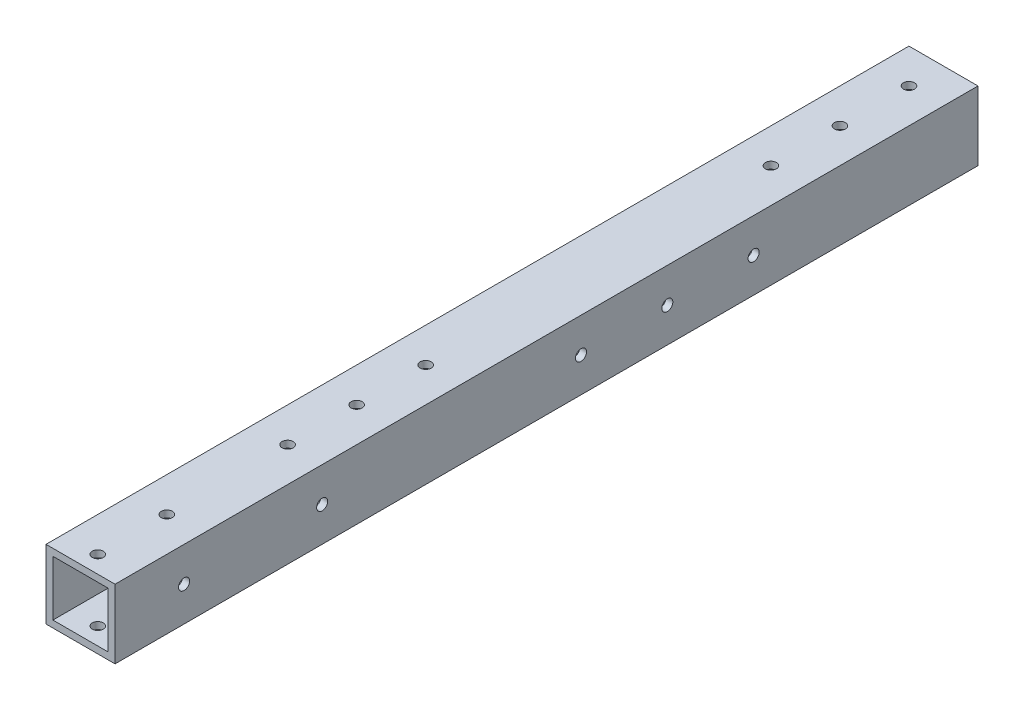
ISO-10303-21;
HEADER;
FILE_DESCRIPTION(('STEP AP214'),'2;1');
FILE_NAME('part.step','',(''),(''),'','','');
FILE_SCHEMA(('AUTOMOTIVE_DESIGN { 1 0 10303 214 1 1 1 1 }'));
ENDSEC;
DATA;
#1=APPLICATION_CONTEXT('core data for automotive mechanical design processes');
#2=APPLICATION_PROTOCOL_DEFINITION('international standard','automotive_design',2000,#1);
#3=PRODUCT_CONTEXT('',#1,'mechanical');
#4=PRODUCT('Part','Part','',(#3));
#5=PRODUCT_RELATED_PRODUCT_CATEGORY('part','',(#4));
#6=PRODUCT_DEFINITION_FORMATION('','',#4);
#7=PRODUCT_DEFINITION_CONTEXT('part definition',#1,'design');
#8=PRODUCT_DEFINITION('design','',#6,#7);
#9=PRODUCT_DEFINITION_SHAPE('','',#8);
#10=(LENGTH_UNIT() NAMED_UNIT(*) SI_UNIT(.MILLI.,.METRE.));
#11=(NAMED_UNIT(*) PLANE_ANGLE_UNIT() SI_UNIT($,.RADIAN.));
#12=(NAMED_UNIT(*) SI_UNIT($,.STERADIAN.) SOLID_ANGLE_UNIT());
#13=UNCERTAINTY_MEASURE_WITH_UNIT(LENGTH_MEASURE(1.E-05),#10,'distance_accuracy_value','');
#14=(GEOMETRIC_REPRESENTATION_CONTEXT(3) GLOBAL_UNCERTAINTY_ASSIGNED_CONTEXT((#13)) GLOBAL_UNIT_ASSIGNED_CONTEXT((#10,
#11,#12)) REPRESENTATION_CONTEXT('',''));
#15=CARTESIAN_POINT('',(0.,0.,0.));
#16=DIRECTION('',(0.,0.,1.));
#17=DIRECTION('',(1.,0.,0.));
#18=AXIS2_PLACEMENT_3D('',#15,#16,#17);
#19=CARTESIAN_POINT('',(0.,0.,250.));
#20=DIRECTION('',(0.,0.,1.));
#21=DIRECTION('',(1.,0.,0.));
#22=AXIS2_PLACEMENT_3D('',#19,#20,#21);
#23=PLANE('',#22);
#24=DIRECTION('',(0.,-1.,0.));
#25=VECTOR('',#24,1.);
#26=CARTESIAN_POINT('',(0.,0.,250.));
#27=LINE('',#26,#25);
#28=CARTESIAN_POINT('',(0.,20.,250.));
#29=VERTEX_POINT('',#28);
#30=CARTESIAN_POINT('',(0.,0.,250.));
#31=VERTEX_POINT('',#30);
#32=EDGE_CURVE('E176',#29,#31,#27,.T.);
#33=ORIENTED_EDGE('',*,*,#32,.T.);
#34=DIRECTION('',(1.,0.,0.));
#35=VECTOR('',#34,1.);
#36=CARTESIAN_POINT('',(0.,0.,250.));
#37=LINE('',#36,#35);
#38=CARTESIAN_POINT('',(20.,0.,250.));
#39=VERTEX_POINT('',#38);
#40=EDGE_CURVE('E179',#31,#39,#37,.T.);
#41=ORIENTED_EDGE('',*,*,#40,.T.);
#42=DIRECTION('',(0.,1.,0.));
#43=VECTOR('',#42,1.);
#44=CARTESIAN_POINT('',(20.,0.,250.));
#45=LINE('',#44,#43);
#46=CARTESIAN_POINT('',(20.,20.,250.));
#47=VERTEX_POINT('',#46);
#48=EDGE_CURVE('E182',#39,#47,#45,.T.);
#49=ORIENTED_EDGE('',*,*,#48,.T.);
#50=DIRECTION('',(-1.,0.,0.));
#51=VECTOR('',#50,1.);
#52=CARTESIAN_POINT('',(0.,20.,250.));
#53=LINE('',#52,#51);
#54=EDGE_CURVE('E184',#47,#29,#53,.T.);
#55=ORIENTED_EDGE('',*,*,#54,.T.);
#56=EDGE_LOOP('',(#33,#41,#49,#55));
#57=FACE_BOUND('',#56,.T.);
#58=DIRECTION('',(1.,0.,0.));
#59=VECTOR('',#58,1.);
#60=CARTESIAN_POINT('',(0.,2.,250.));
#61=LINE('',#60,#59);
#62=CARTESIAN_POINT('',(2.,2.,250.));
#63=VERTEX_POINT('',#62);
#64=CARTESIAN_POINT('',(18.,2.,250.));
#65=VERTEX_POINT('',#64);
#66=EDGE_CURVE('E146',#63,#65,#61,.T.);
#67=ORIENTED_EDGE('',*,*,#66,.F.);
#68=DIRECTION('',(0.,-1.,0.));
#69=VECTOR('',#68,1.);
#70=CARTESIAN_POINT('',(2.,0.,250.));
#71=LINE('',#70,#69);
#72=CARTESIAN_POINT('',(2.,18.,250.));
#73=VERTEX_POINT('',#72);
#74=EDGE_CURVE('E138',#73,#63,#71,.T.);
#75=ORIENTED_EDGE('',*,*,#74,.F.);
#76=DIRECTION('',(-1.,0.,0.));
#77=VECTOR('',#76,1.);
#78=CARTESIAN_POINT('',(0.,18.,250.));
#79=LINE('',#78,#77);
#80=CARTESIAN_POINT('',(18.,18.,250.));
#81=VERTEX_POINT('',#80);
#82=EDGE_CURVE('E160',#81,#73,#79,.T.);
#83=ORIENTED_EDGE('',*,*,#82,.F.);
#84=DIRECTION('',(0.,1.,0.));
#85=VECTOR('',#84,1.);
#86=CARTESIAN_POINT('',(18.,0.,250.));
#87=LINE('',#86,#85);
#88=EDGE_CURVE('E158',#65,#81,#87,.T.);
#89=ORIENTED_EDGE('',*,*,#88,.F.);
#90=EDGE_LOOP('',(#67,#75,#83,#89));
#91=FACE_BOUND('',#90,.T.);
#92=ADVANCED_FACE('F71',(#57,#91),#23,.T.);
#93=CARTESIAN_POINT('',(0.,0.,0.));
#94=DIRECTION('',(0.,0.,1.));
#95=DIRECTION('',(1.,0.,0.));
#96=AXIS2_PLACEMENT_3D('',#93,#94,#95);
#97=PLANE('',#96);
#98=DIRECTION('',(0.,-1.,0.));
#99=VECTOR('',#98,1.);
#100=CARTESIAN_POINT('',(0.,0.,0.));
#101=LINE('',#100,#99);
#102=CARTESIAN_POINT('',(0.,20.,0.));
#103=VERTEX_POINT('',#102);
#104=CARTESIAN_POINT('',(0.,0.,0.));
#105=VERTEX_POINT('',#104);
#106=EDGE_CURVE('E154',#103,#105,#101,.T.);
#107=ORIENTED_EDGE('',*,*,#106,.F.);
#108=DIRECTION('',(-1.,0.,0.));
#109=VECTOR('',#108,1.);
#110=CARTESIAN_POINT('',(0.,20.,0.));
#111=LINE('',#110,#109);
#112=CARTESIAN_POINT('',(20.,20.,0.));
#113=VERTEX_POINT('',#112);
#114=EDGE_CURVE('E180',#113,#103,#111,.T.);
#115=ORIENTED_EDGE('',*,*,#114,.F.);
#116=DIRECTION('',(0.,1.,0.));
#117=VECTOR('',#116,1.);
#118=CARTESIAN_POINT('',(20.,0.,0.));
#119=LINE('',#118,#117);
#120=CARTESIAN_POINT('',(20.,0.,0.));
#121=VERTEX_POINT('',#120);
#122=EDGE_CURVE('E191',#121,#113,#119,.T.);
#123=ORIENTED_EDGE('',*,*,#122,.F.);
#124=DIRECTION('',(1.,0.,0.));
#125=VECTOR('',#124,1.);
#126=CARTESIAN_POINT('',(0.,0.,0.));
#127=LINE('',#126,#125);
#128=EDGE_CURVE('E189',#105,#121,#127,.T.);
#129=ORIENTED_EDGE('',*,*,#128,.F.);
#130=EDGE_LOOP('',(#107,#115,#123,#129));
#131=FACE_BOUND('',#130,.T.);
#132=DIRECTION('',(0.,-1.,0.));
#133=VECTOR('',#132,1.);
#134=CARTESIAN_POINT('',(2.,0.,0.));
#135=LINE('',#134,#133);
#136=CARTESIAN_POINT('',(2.,18.,0.));
#137=VERTEX_POINT('',#136);
#138=CARTESIAN_POINT('',(2.,2.,0.));
#139=VERTEX_POINT('',#138);
#140=EDGE_CURVE('E96',#137,#139,#135,.T.);
#141=ORIENTED_EDGE('',*,*,#140,.T.);
#142=DIRECTION('',(1.,0.,0.));
#143=VECTOR('',#142,1.);
#144=CARTESIAN_POINT('',(0.,2.,0.));
#145=LINE('',#144,#143);
#146=CARTESIAN_POINT('',(18.,2.,0.));
#147=VERTEX_POINT('',#146);
#148=EDGE_CURVE('E153',#139,#147,#145,.T.);
#149=ORIENTED_EDGE('',*,*,#148,.T.);
#150=DIRECTION('',(0.,1.,0.));
#151=VECTOR('',#150,1.);
#152=CARTESIAN_POINT('',(18.,0.,0.));
#153=LINE('',#152,#151);
#154=CARTESIAN_POINT('',(18.,18.,0.));
#155=VERTEX_POINT('',#154);
#156=EDGE_CURVE('E168',#147,#155,#153,.T.);
#157=ORIENTED_EDGE('',*,*,#156,.T.);
#158=DIRECTION('',(-1.,0.,0.));
#159=VECTOR('',#158,1.);
#160=CARTESIAN_POINT('',(0.,18.,0.));
#161=LINE('',#160,#159);
#162=EDGE_CURVE('E147',#155,#137,#161,.T.);
#163=ORIENTED_EDGE('',*,*,#162,.T.);
#164=EDGE_LOOP('',(#141,#149,#157,#163));
#165=FACE_BOUND('',#164,.T.);
#166=ADVANCED_FACE('F377',(#131,#165),#97,.F.);
#167=CARTESIAN_POINT('',(0.,0.,250.));
#168=DIRECTION('',(1.,0.,0.));
#169=DIRECTION('',(0.,0.,-1.));
#170=AXIS2_PLACEMENT_3D('',#167,#168,#169);
#171=PLANE('',#170);
#172=CARTESIAN_POINT('',(0.,9.99999999999999,65.));
#173=DIRECTION('',(1.,0.,0.));
#174=DIRECTION('',(0.,0.,-1.));
#175=AXIS2_PLACEMENT_3D('',#172,#173,#174);
#176=CIRCLE('',#175,1.6);
#177=CARTESIAN_POINT('',(0.,9.99999999999999,63.4));
#178=VERTEX_POINT('',#177);
#179=EDGE_CURVE('E453',#178,#178,#176,.T.);
#180=ORIENTED_EDGE('',*,*,#179,.T.);
#181=EDGE_LOOP('',(#180));
#182=FACE_BOUND('',#181,.T.);
#183=CARTESIAN_POINT('',(0.,9.99999999999998,115.));
#184=DIRECTION('',(1.,0.,0.));
#185=DIRECTION('',(0.,0.,-1.));
#186=AXIS2_PLACEMENT_3D('',#183,#184,#185);
#187=CIRCLE('',#186,1.6);
#188=CARTESIAN_POINT('',(0.,9.99999999999998,113.4));
#189=VERTEX_POINT('',#188);
#190=EDGE_CURVE('E457',#189,#189,#187,.T.);
#191=ORIENTED_EDGE('',*,*,#190,.T.);
#192=EDGE_LOOP('',(#191));
#193=FACE_BOUND('',#192,.T.);
#194=CARTESIAN_POINT('',(0.,9.99999999999999,90.));
#195=DIRECTION('',(1.,0.,0.));
#196=DIRECTION('',(0.,0.,-1.));
#197=AXIS2_PLACEMENT_3D('',#194,#195,#196);
#198=CIRCLE('',#197,1.6);
#199=CARTESIAN_POINT('',(0.,9.99999999999999,88.4));
#200=VERTEX_POINT('',#199);
#201=EDGE_CURVE('E246',#200,#200,#198,.T.);
#202=ORIENTED_EDGE('',*,*,#201,.T.);
#203=EDGE_LOOP('',(#202));
#204=FACE_BOUND('',#203,.T.);
#205=CARTESIAN_POINT('',(0.,10.,230.));
#206=DIRECTION('',(1.,0.,0.));
#207=DIRECTION('',(0.,0.,-1.));
#208=AXIS2_PLACEMENT_3D('',#205,#206,#207);
#209=CIRCLE('',#208,1.59999999999999);
#210=CARTESIAN_POINT('',(0.,10.,228.4));
#211=VERTEX_POINT('',#210);
#212=EDGE_CURVE('E238',#211,#211,#209,.T.);
#213=ORIENTED_EDGE('',*,*,#212,.T.);
#214=EDGE_LOOP('',(#213));
#215=FACE_BOUND('',#214,.T.);
#216=CARTESIAN_POINT('',(0.,10.,190.));
#217=DIRECTION('',(1.,0.,0.));
#218=DIRECTION('',(0.,0.,-1.));
#219=AXIS2_PLACEMENT_3D('',#216,#217,#218);
#220=CIRCLE('',#219,1.59999999999999);
#221=CARTESIAN_POINT('',(0.,10.,188.4));
#222=VERTEX_POINT('',#221);
#223=EDGE_CURVE('E265',#222,#222,#220,.T.);
#224=ORIENTED_EDGE('',*,*,#223,.T.);
#225=EDGE_LOOP('',(#224));
#226=FACE_BOUND('',#225,.T.);
#227=ORIENTED_EDGE('',*,*,#106,.T.);
#228=DIRECTION('',(0.,0.,-1.));
#229=VECTOR('',#228,1.);
#230=CARTESIAN_POINT('',(0.,0.,250.));
#231=LINE('',#230,#229);
#232=EDGE_CURVE('E12',#31,#105,#231,.T.);
#233=ORIENTED_EDGE('',*,*,#232,.F.);
#234=ORIENTED_EDGE('',*,*,#32,.F.);
#235=DIRECTION('',(0.,0.,-1.));
#236=VECTOR('',#235,1.);
#237=CARTESIAN_POINT('',(0.,20.,250.));
#238=LINE('',#237,#236);
#239=EDGE_CURVE('E186',#29,#103,#238,.T.);
#240=ORIENTED_EDGE('',*,*,#239,.T.);
#241=EDGE_LOOP('',(#227,#233,#234,#240));
#242=FACE_BOUND('',#241,.T.);
#243=ADVANCED_FACE('F73',(#182,#193,#204,#215,#226,#242),#171,.F.);
#244=CARTESIAN_POINT('',(0.,0.,250.));
#245=DIRECTION('',(0.,1.,0.));
#246=DIRECTION('',(0.,0.,1.));
#247=AXIS2_PLACEMENT_3D('',#244,#245,#246);
#248=PLANE('',#247);
#249=CARTESIAN_POINT('',(10.,0.,150.));
#250=DIRECTION('',(0.,1.,0.));
#251=DIRECTION('',(0.,0.,1.));
#252=AXIS2_PLACEMENT_3D('',#249,#250,#251);
#253=CIRCLE('',#252,1.6);
#254=CARTESIAN_POINT('',(10.,0.,151.6));
#255=VERTEX_POINT('',#254);
#256=EDGE_CURVE('E217',#255,#255,#253,.T.);
#257=ORIENTED_EDGE('',*,*,#256,.T.);
#258=EDGE_LOOP('',(#257));
#259=FACE_BOUND('',#258,.T.);
#260=CARTESIAN_POINT('',(10.,0.,170.));
#261=DIRECTION('',(0.,1.,0.));
#262=DIRECTION('',(0.,0.,1.));
#263=AXIS2_PLACEMENT_3D('',#260,#261,#262);
#264=CIRCLE('',#263,1.59999999999999);
#265=CARTESIAN_POINT('',(10.,0.,171.6));
#266=VERTEX_POINT('',#265);
#267=EDGE_CURVE('E289',#266,#266,#264,.T.);
#268=ORIENTED_EDGE('',*,*,#267,.T.);
#269=EDGE_LOOP('',(#268));
#270=FACE_BOUND('',#269,.T.);
#271=CARTESIAN_POINT('',(10.,0.,190.));
#272=DIRECTION('',(0.,1.,0.));
#273=DIRECTION('',(0.,0.,1.));
#274=AXIS2_PLACEMENT_3D('',#271,#272,#273);
#275=CIRCLE('',#274,1.59999999999999);
#276=CARTESIAN_POINT('',(10.,0.,191.6));
#277=VERTEX_POINT('',#276);
#278=EDGE_CURVE('E295',#277,#277,#275,.T.);
#279=ORIENTED_EDGE('',*,*,#278,.T.);
#280=EDGE_LOOP('',(#279));
#281=FACE_BOUND('',#280,.T.);
#282=CARTESIAN_POINT('',(10.,0.,245.));
#283=DIRECTION('',(0.,1.,0.));
#284=DIRECTION('',(0.,0.,1.));
#285=AXIS2_PLACEMENT_3D('',#282,#283,#284);
#286=CIRCLE('',#285,1.59999999999999);
#287=CARTESIAN_POINT('',(10.,0.,246.6));
#288=VERTEX_POINT('',#287);
#289=EDGE_CURVE('E301',#288,#288,#286,.T.);
#290=ORIENTED_EDGE('',*,*,#289,.T.);
#291=EDGE_LOOP('',(#290));
#292=FACE_BOUND('',#291,.T.);
#293=CARTESIAN_POINT('',(10.,0.,225.));
#294=DIRECTION('',(0.,1.,0.));
#295=DIRECTION('',(0.,0.,1.));
#296=AXIS2_PLACEMENT_3D('',#293,#294,#295);
#297=CIRCLE('',#296,1.59999999999999);
#298=CARTESIAN_POINT('',(10.,0.,226.6));
#299=VERTEX_POINT('',#298);
#300=EDGE_CURVE('E280',#299,#299,#297,.T.);
#301=ORIENTED_EDGE('',*,*,#300,.T.);
#302=EDGE_LOOP('',(#301));
#303=FACE_BOUND('',#302,.T.);
#304=CARTESIAN_POINT('',(10.,0.,10.));
#305=DIRECTION('',(0.,-1.,0.));
#306=DIRECTION('',(0.,0.,-1.));
#307=AXIS2_PLACEMENT_3D('',#304,#305,#306);
#308=CIRCLE('',#307,1.6);
#309=CARTESIAN_POINT('',(10.,0.,8.4));
#310=VERTEX_POINT('',#309);
#311=EDGE_CURVE('E322',#310,#310,#308,.T.);
#312=ORIENTED_EDGE('',*,*,#311,.F.);
#313=EDGE_LOOP('',(#312));
#314=FACE_BOUND('',#313,.T.);
#315=CARTESIAN_POINT('',(10.,0.,30.));
#316=DIRECTION('',(0.,-1.,0.));
#317=DIRECTION('',(0.,0.,-1.));
#318=AXIS2_PLACEMENT_3D('',#315,#316,#317);
#319=CIRCLE('',#318,1.6);
#320=CARTESIAN_POINT('',(10.,0.,28.4));
#321=VERTEX_POINT('',#320);
#322=EDGE_CURVE('E325',#321,#321,#319,.T.);
#323=ORIENTED_EDGE('',*,*,#322,.F.);
#324=EDGE_LOOP('',(#323));
#325=FACE_BOUND('',#324,.T.);
#326=CARTESIAN_POINT('',(10.,0.,50.));
#327=DIRECTION('',(0.,-1.,0.));
#328=DIRECTION('',(0.,0.,-1.));
#329=AXIS2_PLACEMENT_3D('',#326,#327,#328);
#330=CIRCLE('',#329,1.6);
#331=CARTESIAN_POINT('',(10.,0.,48.4));
#332=VERTEX_POINT('',#331);
#333=EDGE_CURVE('E331',#332,#332,#330,.T.);
#334=ORIENTED_EDGE('',*,*,#333,.F.);
#335=EDGE_LOOP('',(#334));
#336=FACE_BOUND('',#335,.T.);
#337=ORIENTED_EDGE('',*,*,#128,.T.);
#338=DIRECTION('',(0.,0.,-1.));
#339=VECTOR('',#338,1.);
#340=CARTESIAN_POINT('',(20.,0.,250.));
#341=LINE('',#340,#339);
#342=EDGE_CURVE('E80',#39,#121,#341,.T.);
#343=ORIENTED_EDGE('',*,*,#342,.F.);
#344=ORIENTED_EDGE('',*,*,#40,.F.);
#345=ORIENTED_EDGE('',*,*,#232,.T.);
#346=EDGE_LOOP('',(#337,#343,#344,#345));
#347=FACE_BOUND('',#346,.T.);
#348=ADVANCED_FACE('F363',(#259,#270,#281,#292,#303,#314,#325,#336,#347),#248,.F.);
#349=CARTESIAN_POINT('',(20.,0.,250.));
#350=DIRECTION('',(-1.,0.,0.));
#351=DIRECTION('',(0.,0.,1.));
#352=AXIS2_PLACEMENT_3D('',#349,#350,#351);
#353=PLANE('',#352);
#354=CARTESIAN_POINT('',(20.,9.99999999999999,65.));
#355=DIRECTION('',(1.,0.,0.));
#356=DIRECTION('',(0.,0.,-1.));
#357=AXIS2_PLACEMENT_3D('',#354,#355,#356);
#358=CIRCLE('',#357,1.6);
#359=CARTESIAN_POINT('',(20.,9.99999999999999,63.4));
#360=VERTEX_POINT('',#359);
#361=EDGE_CURVE('E405',#360,#360,#358,.T.);
#362=ORIENTED_EDGE('',*,*,#361,.F.);
#363=EDGE_LOOP('',(#362));
#364=FACE_BOUND('',#363,.T.);
#365=CARTESIAN_POINT('',(20.,9.99999999999998,115.));
#366=DIRECTION('',(1.,0.,0.));
#367=DIRECTION('',(0.,0.,-1.));
#368=AXIS2_PLACEMENT_3D('',#365,#366,#367);
#369=CIRCLE('',#368,1.6);
#370=CARTESIAN_POINT('',(20.,9.99999999999998,113.4));
#371=VERTEX_POINT('',#370);
#372=EDGE_CURVE('E409',#371,#371,#369,.T.);
#373=ORIENTED_EDGE('',*,*,#372,.F.);
#374=EDGE_LOOP('',(#373));
#375=FACE_BOUND('',#374,.T.);
#376=CARTESIAN_POINT('',(20.,9.99999999999999,90.));
#377=DIRECTION('',(1.,0.,0.));
#378=DIRECTION('',(0.,0.,-1.));
#379=AXIS2_PLACEMENT_3D('',#376,#377,#378);
#380=CIRCLE('',#379,1.6);
#381=CARTESIAN_POINT('',(20.,9.99999999999999,88.4));
#382=VERTEX_POINT('',#381);
#383=EDGE_CURVE('E259',#382,#382,#380,.T.);
#384=ORIENTED_EDGE('',*,*,#383,.F.);
#385=EDGE_LOOP('',(#384));
#386=FACE_BOUND('',#385,.T.);
#387=CARTESIAN_POINT('',(20.,10.,230.));
#388=DIRECTION('',(1.,0.,0.));
#389=DIRECTION('',(0.,0.,-1.));
#390=AXIS2_PLACEMENT_3D('',#387,#388,#389);
#391=CIRCLE('',#390,1.59999999999999);
#392=CARTESIAN_POINT('',(20.,10.,228.4));
#393=VERTEX_POINT('',#392);
#394=EDGE_CURVE('E268',#393,#393,#391,.T.);
#395=ORIENTED_EDGE('',*,*,#394,.F.);
#396=EDGE_LOOP('',(#395));
#397=FACE_BOUND('',#396,.T.);
#398=CARTESIAN_POINT('',(20.,10.,190.));
#399=DIRECTION('',(1.,0.,0.));
#400=DIRECTION('',(0.,0.,-1.));
#401=AXIS2_PLACEMENT_3D('',#398,#399,#400);
#402=CIRCLE('',#401,1.59999999999999);
#403=CARTESIAN_POINT('',(20.,10.,188.4));
#404=VERTEX_POINT('',#403);
#405=EDGE_CURVE('E271',#404,#404,#402,.T.);
#406=ORIENTED_EDGE('',*,*,#405,.F.);
#407=EDGE_LOOP('',(#406));
#408=FACE_BOUND('',#407,.T.);
#409=ORIENTED_EDGE('',*,*,#122,.T.);
#410=DIRECTION('',(0.,0.,-1.));
#411=VECTOR('',#410,1.);
#412=CARTESIAN_POINT('',(20.,20.,250.));
#413=LINE('',#412,#411);
#414=EDGE_CURVE('E196',#47,#113,#413,.T.);
#415=ORIENTED_EDGE('',*,*,#414,.F.);
#416=ORIENTED_EDGE('',*,*,#48,.F.);
#417=ORIENTED_EDGE('',*,*,#342,.T.);
#418=EDGE_LOOP('',(#409,#415,#416,#417));
#419=FACE_BOUND('',#418,.T.);
#420=ADVANCED_FACE('F366',(#364,#375,#386,#397,#408,#419),#353,.F.);
#421=CARTESIAN_POINT('',(0.,20.,250.));
#422=DIRECTION('',(0.,-1.,0.));
#423=DIRECTION('',(0.,0.,-1.));
#424=AXIS2_PLACEMENT_3D('',#421,#422,#423);
#425=PLANE('',#424);
#426=CARTESIAN_POINT('',(10.,20.,150.));
#427=DIRECTION('',(0.,1.,0.));
#428=DIRECTION('',(0.,0.,1.));
#429=AXIS2_PLACEMENT_3D('',#426,#427,#428);
#430=CIRCLE('',#429,1.6);
#431=CARTESIAN_POINT('',(10.,20.,151.6));
#432=VERTEX_POINT('',#431);
#433=EDGE_CURVE('E283',#432,#432,#430,.T.);
#434=ORIENTED_EDGE('',*,*,#433,.F.);
#435=EDGE_LOOP('',(#434));
#436=FACE_BOUND('',#435,.T.);
#437=CARTESIAN_POINT('',(10.,20.,170.));
#438=DIRECTION('',(0.,1.,0.));
#439=DIRECTION('',(0.,0.,1.));
#440=AXIS2_PLACEMENT_3D('',#437,#438,#439);
#441=CIRCLE('',#440,1.59999999999999);
#442=CARTESIAN_POINT('',(10.,20.,171.6));
#443=VERTEX_POINT('',#442);
#444=EDGE_CURVE('E286',#443,#443,#441,.T.);
#445=ORIENTED_EDGE('',*,*,#444,.F.);
#446=EDGE_LOOP('',(#445));
#447=FACE_BOUND('',#446,.T.);
#448=CARTESIAN_POINT('',(10.,20.,190.));
#449=DIRECTION('',(0.,1.,0.));
#450=DIRECTION('',(0.,0.,1.));
#451=AXIS2_PLACEMENT_3D('',#448,#449,#450);
#452=CIRCLE('',#451,1.59999999999999);
#453=CARTESIAN_POINT('',(10.,20.,191.6));
#454=VERTEX_POINT('',#453);
#455=EDGE_CURVE('E292',#454,#454,#452,.T.);
#456=ORIENTED_EDGE('',*,*,#455,.F.);
#457=EDGE_LOOP('',(#456));
#458=FACE_BOUND('',#457,.T.);
#459=CARTESIAN_POINT('',(10.,20.,245.));
#460=DIRECTION('',(0.,1.,0.));
#461=DIRECTION('',(0.,0.,1.));
#462=AXIS2_PLACEMENT_3D('',#459,#460,#461);
#463=CIRCLE('',#462,1.59999999999999);
#464=CARTESIAN_POINT('',(10.,20.,246.6));
#465=VERTEX_POINT('',#464);
#466=EDGE_CURVE('E298',#465,#465,#463,.T.);
#467=ORIENTED_EDGE('',*,*,#466,.F.);
#468=EDGE_LOOP('',(#467));
#469=FACE_BOUND('',#468,.T.);
#470=CARTESIAN_POINT('',(10.,20.,225.));
#471=DIRECTION('',(0.,1.,0.));
#472=DIRECTION('',(0.,0.,1.));
#473=AXIS2_PLACEMENT_3D('',#470,#471,#472);
#474=CIRCLE('',#473,1.59999999999999);
#475=CARTESIAN_POINT('',(10.,20.,226.6));
#476=VERTEX_POINT('',#475);
#477=EDGE_CURVE('E304',#476,#476,#474,.T.);
#478=ORIENTED_EDGE('',*,*,#477,.F.);
#479=EDGE_LOOP('',(#478));
#480=FACE_BOUND('',#479,.T.);
#481=CARTESIAN_POINT('',(10.,20.,10.));
#482=DIRECTION('',(0.,-1.,0.));
#483=DIRECTION('',(0.,0.,-1.));
#484=AXIS2_PLACEMENT_3D('',#481,#482,#483);
#485=CIRCLE('',#484,1.6);
#486=CARTESIAN_POINT('',(10.,20.,8.4));
#487=VERTEX_POINT('',#486);
#488=EDGE_CURVE('E205',#487,#487,#485,.T.);
#489=ORIENTED_EDGE('',*,*,#488,.T.);
#490=EDGE_LOOP('',(#489));
#491=FACE_BOUND('',#490,.T.);
#492=CARTESIAN_POINT('',(10.,20.,30.));
#493=DIRECTION('',(0.,-1.,0.));
#494=DIRECTION('',(0.,0.,-1.));
#495=AXIS2_PLACEMENT_3D('',#492,#493,#494);
#496=CIRCLE('',#495,1.6);
#497=CARTESIAN_POINT('',(10.,20.,28.4));
#498=VERTEX_POINT('',#497);
#499=EDGE_CURVE('E328',#498,#498,#496,.T.);
#500=ORIENTED_EDGE('',*,*,#499,.T.);
#501=EDGE_LOOP('',(#500));
#502=FACE_BOUND('',#501,.T.);
#503=CARTESIAN_POINT('',(10.,20.,50.));
#504=DIRECTION('',(0.,-1.,0.));
#505=DIRECTION('',(0.,0.,-1.));
#506=AXIS2_PLACEMENT_3D('',#503,#504,#505);
#507=CIRCLE('',#506,1.6);
#508=CARTESIAN_POINT('',(10.,20.,48.4));
#509=VERTEX_POINT('',#508);
#510=EDGE_CURVE('E319',#509,#509,#507,.T.);
#511=ORIENTED_EDGE('',*,*,#510,.T.);
#512=EDGE_LOOP('',(#511));
#513=FACE_BOUND('',#512,.T.);
#514=ORIENTED_EDGE('',*,*,#114,.T.);
#515=ORIENTED_EDGE('',*,*,#239,.F.);
#516=ORIENTED_EDGE('',*,*,#54,.F.);
#517=ORIENTED_EDGE('',*,*,#414,.T.);
#518=EDGE_LOOP('',(#514,#515,#516,#517));
#519=FACE_BOUND('',#518,.T.);
#520=ADVANCED_FACE('F381',(#436,#447,#458,#469,#480,#491,#502,#513,#519),#425,.F.);
#521=CARTESIAN_POINT('',(2.,0.,250.));
#522=DIRECTION('',(1.,0.,0.));
#523=DIRECTION('',(0.,0.,-1.));
#524=AXIS2_PLACEMENT_3D('',#521,#522,#523);
#525=PLANE('',#524);
#526=CARTESIAN_POINT('',(2.,9.99999999999999,65.));
#527=DIRECTION('',(1.,0.,0.));
#528=DIRECTION('',(0.,0.,-1.));
#529=AXIS2_PLACEMENT_3D('',#526,#527,#528);
#530=CIRCLE('',#529,1.6);
#531=CARTESIAN_POINT('',(2.,9.99999999999999,63.4));
#532=VERTEX_POINT('',#531);
#533=EDGE_CURVE('E262',#532,#532,#530,.T.);
#534=ORIENTED_EDGE('',*,*,#533,.F.);
#535=EDGE_LOOP('',(#534));
#536=FACE_BOUND('',#535,.T.);
#537=CARTESIAN_POINT('',(2.,9.99999999999998,115.));
#538=DIRECTION('',(1.,0.,0.));
#539=DIRECTION('',(0.,0.,-1.));
#540=AXIS2_PLACEMENT_3D('',#537,#538,#539);
#541=CIRCLE('',#540,1.6);
#542=CARTESIAN_POINT('',(2.,9.99999999999998,113.4));
#543=VERTEX_POINT('',#542);
#544=EDGE_CURVE('E249',#543,#543,#541,.T.);
#545=ORIENTED_EDGE('',*,*,#544,.F.);
#546=EDGE_LOOP('',(#545));
#547=FACE_BOUND('',#546,.T.);
#548=CARTESIAN_POINT('',(2.,9.99999999999999,90.));
#549=DIRECTION('',(1.,0.,0.));
#550=DIRECTION('',(0.,0.,-1.));
#551=AXIS2_PLACEMENT_3D('',#548,#549,#550);
#552=CIRCLE('',#551,1.6);
#553=CARTESIAN_POINT('',(2.,9.99999999999999,88.4));
#554=VERTEX_POINT('',#553);
#555=EDGE_CURVE('E245',#554,#554,#552,.T.);
#556=ORIENTED_EDGE('',*,*,#555,.F.);
#557=EDGE_LOOP('',(#556));
#558=FACE_BOUND('',#557,.T.);
#559=CARTESIAN_POINT('',(2.,10.,230.));
#560=DIRECTION('',(1.,0.,0.));
#561=DIRECTION('',(0.,0.,-1.));
#562=AXIS2_PLACEMENT_3D('',#559,#560,#561);
#563=CIRCLE('',#562,1.59999999999999);
#564=CARTESIAN_POINT('',(2.,10.,228.4));
#565=VERTEX_POINT('',#564);
#566=EDGE_CURVE('E242',#565,#565,#563,.T.);
#567=ORIENTED_EDGE('',*,*,#566,.F.);
#568=EDGE_LOOP('',(#567));
#569=FACE_BOUND('',#568,.T.);
#570=CARTESIAN_POINT('',(2.,10.,190.));
#571=DIRECTION('',(1.,0.,0.));
#572=DIRECTION('',(0.,0.,-1.));
#573=AXIS2_PLACEMENT_3D('',#570,#571,#572);
#574=CIRCLE('',#573,1.59999999999999);
#575=CARTESIAN_POINT('',(2.,10.,188.4));
#576=VERTEX_POINT('',#575);
#577=EDGE_CURVE('E237',#576,#576,#574,.T.);
#578=ORIENTED_EDGE('',*,*,#577,.F.);
#579=EDGE_LOOP('',(#578));
#580=FACE_BOUND('',#579,.T.);
#581=ORIENTED_EDGE('',*,*,#140,.F.);
#582=DIRECTION('',(0.,0.,-1.));
#583=VECTOR('',#582,1.);
#584=CARTESIAN_POINT('',(2.,18.,250.));
#585=LINE('',#584,#583);
#586=EDGE_CURVE('E142',#73,#137,#585,.T.);
#587=ORIENTED_EDGE('',*,*,#586,.F.);
#588=ORIENTED_EDGE('',*,*,#74,.T.);
#589=DIRECTION('',(0.,0.,-1.));
#590=VECTOR('',#589,1.);
#591=CARTESIAN_POINT('',(2.,2.,250.));
#592=LINE('',#591,#590);
#593=EDGE_CURVE('E141',#63,#139,#592,.T.);
#594=ORIENTED_EDGE('',*,*,#593,.T.);
#595=EDGE_LOOP('',(#581,#587,#588,#594));
#596=FACE_BOUND('',#595,.T.);
#597=ADVANCED_FACE('F140',(#536,#547,#558,#569,#580,#596),#525,.T.);
#598=CARTESIAN_POINT('',(0.,2.,250.));
#599=DIRECTION('',(0.,1.,0.));
#600=DIRECTION('',(0.,0.,1.));
#601=AXIS2_PLACEMENT_3D('',#598,#599,#600);
#602=PLANE('',#601);
#603=CARTESIAN_POINT('',(10.,2.,150.));
#604=DIRECTION('',(0.,1.,0.));
#605=DIRECTION('',(0.,0.,1.));
#606=AXIS2_PLACEMENT_3D('',#603,#604,#605);
#607=CIRCLE('',#606,1.6);
#608=CARTESIAN_POINT('',(10.,2.,151.6));
#609=VERTEX_POINT('',#608);
#610=EDGE_CURVE('E233',#609,#609,#607,.T.);
#611=ORIENTED_EDGE('',*,*,#610,.F.);
#612=EDGE_LOOP('',(#611));
#613=FACE_BOUND('',#612,.T.);
#614=CARTESIAN_POINT('',(10.,2.,170.));
#615=DIRECTION('',(0.,1.,0.));
#616=DIRECTION('',(0.,0.,1.));
#617=AXIS2_PLACEMENT_3D('',#614,#615,#616);
#618=CIRCLE('',#617,1.59999999999999);
#619=CARTESIAN_POINT('',(10.,2.,171.6));
#620=VERTEX_POINT('',#619);
#621=EDGE_CURVE('E229',#620,#620,#618,.T.);
#622=ORIENTED_EDGE('',*,*,#621,.F.);
#623=EDGE_LOOP('',(#622));
#624=FACE_BOUND('',#623,.T.);
#625=CARTESIAN_POINT('',(10.,2.,190.));
#626=DIRECTION('',(0.,1.,0.));
#627=DIRECTION('',(0.,0.,1.));
#628=AXIS2_PLACEMENT_3D('',#625,#626,#627);
#629=CIRCLE('',#628,1.59999999999999);
#630=CARTESIAN_POINT('',(10.,2.,191.6));
#631=VERTEX_POINT('',#630);
#632=EDGE_CURVE('E225',#631,#631,#629,.T.);
#633=ORIENTED_EDGE('',*,*,#632,.F.);
#634=EDGE_LOOP('',(#633));
#635=FACE_BOUND('',#634,.T.);
#636=CARTESIAN_POINT('',(10.,2.,245.));
#637=DIRECTION('',(0.,1.,0.));
#638=DIRECTION('',(0.,0.,1.));
#639=AXIS2_PLACEMENT_3D('',#636,#637,#638);
#640=CIRCLE('',#639,1.59999999999999);
#641=CARTESIAN_POINT('',(10.,2.,246.6));
#642=VERTEX_POINT('',#641);
#643=EDGE_CURVE('E221',#642,#642,#640,.T.);
#644=ORIENTED_EDGE('',*,*,#643,.F.);
#645=EDGE_LOOP('',(#644));
#646=FACE_BOUND('',#645,.T.);
#647=CARTESIAN_POINT('',(10.,2.,225.));
#648=DIRECTION('',(0.,1.,0.));
#649=DIRECTION('',(0.,0.,1.));
#650=AXIS2_PLACEMENT_3D('',#647,#648,#649);
#651=CIRCLE('',#650,1.59999999999999);
#652=CARTESIAN_POINT('',(10.,2.,226.6));
#653=VERTEX_POINT('',#652);
#654=EDGE_CURVE('E216',#653,#653,#651,.T.);
#655=ORIENTED_EDGE('',*,*,#654,.F.);
#656=EDGE_LOOP('',(#655));
#657=FACE_BOUND('',#656,.T.);
#658=CARTESIAN_POINT('',(10.,2.,10.));
#659=DIRECTION('',(0.,1.,0.));
#660=DIRECTION('',(0.,0.,1.));
#661=AXIS2_PLACEMENT_3D('',#658,#659,#660);
#662=CIRCLE('',#661,1.6);
#663=CARTESIAN_POINT('',(10.,2.,11.6));
#664=VERTEX_POINT('',#663);
#665=EDGE_CURVE('E166',#664,#664,#662,.T.);
#666=ORIENTED_EDGE('',*,*,#665,.F.);
#667=EDGE_LOOP('',(#666));
#668=FACE_BOUND('',#667,.T.);
#669=CARTESIAN_POINT('',(10.,2.,30.));
#670=DIRECTION('',(0.,1.,0.));
#671=DIRECTION('',(0.,0.,1.));
#672=AXIS2_PLACEMENT_3D('',#669,#670,#671);
#673=CIRCLE('',#672,1.6);
#674=CARTESIAN_POINT('',(10.,2.,31.6));
#675=VERTEX_POINT('',#674);
#676=EDGE_CURVE('E209',#675,#675,#673,.T.);
#677=ORIENTED_EDGE('',*,*,#676,.F.);
#678=EDGE_LOOP('',(#677));
#679=FACE_BOUND('',#678,.T.);
#680=CARTESIAN_POINT('',(10.,2.,50.));
#681=DIRECTION('',(0.,1.,0.));
#682=DIRECTION('',(0.,0.,1.));
#683=AXIS2_PLACEMENT_3D('',#680,#681,#682);
#684=CIRCLE('',#683,1.6);
#685=CARTESIAN_POINT('',(10.,2.,51.6));
#686=VERTEX_POINT('',#685);
#687=EDGE_CURVE('E204',#686,#686,#684,.T.);
#688=ORIENTED_EDGE('',*,*,#687,.F.);
#689=EDGE_LOOP('',(#688));
#690=FACE_BOUND('',#689,.T.);
#691=ORIENTED_EDGE('',*,*,#148,.F.);
#692=ORIENTED_EDGE('',*,*,#593,.F.);
#693=ORIENTED_EDGE('',*,*,#66,.T.);
#694=DIRECTION('',(0.,0.,-1.));
#695=VECTOR('',#694,1.);
#696=CARTESIAN_POINT('',(18.,2.,250.));
#697=LINE('',#696,#695);
#698=EDGE_CURVE('E155',#65,#147,#697,.T.);
#699=ORIENTED_EDGE('',*,*,#698,.T.);
#700=EDGE_LOOP('',(#691,#692,#693,#699));
#701=FACE_BOUND('',#700,.T.);
#702=ADVANCED_FACE('F150',(#613,#624,#635,#646,#657,#668,#679,#690,#701),#602,.T.);
#703=CARTESIAN_POINT('',(18.,0.,250.));
#704=DIRECTION('',(-1.,0.,0.));
#705=DIRECTION('',(0.,0.,1.));
#706=AXIS2_PLACEMENT_3D('',#703,#704,#705);
#707=PLANE('',#706);
#708=CARTESIAN_POINT('',(18.,9.99999999999999,65.));
#709=DIRECTION('',(-1.,0.,0.));
#710=DIRECTION('',(0.,0.,1.));
#711=AXIS2_PLACEMENT_3D('',#708,#709,#710);
#712=CIRCLE('',#711,1.6);
#713=CARTESIAN_POINT('',(18.,9.99999999999999,66.6));
#714=VERTEX_POINT('',#713);
#715=EDGE_CURVE('E75',#714,#714,#712,.T.);
#716=ORIENTED_EDGE('',*,*,#715,.F.);
#717=EDGE_LOOP('',(#716));
#718=FACE_BOUND('',#717,.T.);
#719=CARTESIAN_POINT('',(18.,9.99999999999998,115.));
#720=DIRECTION('',(-1.,0.,0.));
#721=DIRECTION('',(0.,0.,1.));
#722=AXIS2_PLACEMENT_3D('',#719,#720,#721);
#723=CIRCLE('',#722,1.6);
#724=CARTESIAN_POINT('',(18.,9.99999999999998,116.6));
#725=VERTEX_POINT('',#724);
#726=EDGE_CURVE('E247',#725,#725,#723,.T.);
#727=ORIENTED_EDGE('',*,*,#726,.F.);
#728=EDGE_LOOP('',(#727));
#729=FACE_BOUND('',#728,.T.);
#730=CARTESIAN_POINT('',(18.,9.99999999999999,90.));
#731=DIRECTION('',(-1.,0.,0.));
#732=DIRECTION('',(0.,0.,1.));
#733=AXIS2_PLACEMENT_3D('',#730,#731,#732);
#734=CIRCLE('',#733,1.6);
#735=CARTESIAN_POINT('',(18.,9.99999999999999,91.6));
#736=VERTEX_POINT('',#735);
#737=EDGE_CURVE('E243',#736,#736,#734,.T.);
#738=ORIENTED_EDGE('',*,*,#737,.F.);
#739=EDGE_LOOP('',(#738));
#740=FACE_BOUND('',#739,.T.);
#741=CARTESIAN_POINT('',(18.,10.,230.));
#742=DIRECTION('',(-1.,0.,0.));
#743=DIRECTION('',(0.,0.,1.));
#744=AXIS2_PLACEMENT_3D('',#741,#742,#743);
#745=CIRCLE('',#744,1.59999999999999);
#746=CARTESIAN_POINT('',(18.,10.,231.6));
#747=VERTEX_POINT('',#746);
#748=EDGE_CURVE('E239',#747,#747,#745,.T.);
#749=ORIENTED_EDGE('',*,*,#748,.F.);
#750=EDGE_LOOP('',(#749));
#751=FACE_BOUND('',#750,.T.);
#752=CARTESIAN_POINT('',(18.,10.,190.));
#753=DIRECTION('',(-1.,0.,0.));
#754=DIRECTION('',(0.,0.,1.));
#755=AXIS2_PLACEMENT_3D('',#752,#753,#754);
#756=CIRCLE('',#755,1.59999999999999);
#757=CARTESIAN_POINT('',(18.,10.,191.6));
#758=VERTEX_POINT('',#757);
#759=EDGE_CURVE('E234',#758,#758,#756,.T.);
#760=ORIENTED_EDGE('',*,*,#759,.F.);
#761=EDGE_LOOP('',(#760));
#762=FACE_BOUND('',#761,.T.);
#763=ORIENTED_EDGE('',*,*,#156,.F.);
#764=ORIENTED_EDGE('',*,*,#698,.F.);
#765=ORIENTED_EDGE('',*,*,#88,.T.);
#766=DIRECTION('',(0.,0.,-1.));
#767=VECTOR('',#766,1.);
#768=CARTESIAN_POINT('',(18.,18.,250.));
#769=LINE('',#768,#767);
#770=EDGE_CURVE('E88',#81,#155,#769,.T.);
#771=ORIENTED_EDGE('',*,*,#770,.T.);
#772=EDGE_LOOP('',(#763,#764,#765,#771));
#773=FACE_BOUND('',#772,.T.);
#774=ADVANCED_FACE('F347',(#718,#729,#740,#751,#762,#773),#707,.T.);
#775=CARTESIAN_POINT('',(0.,18.,250.));
#776=DIRECTION('',(0.,-1.,0.));
#777=DIRECTION('',(0.,0.,-1.));
#778=AXIS2_PLACEMENT_3D('',#775,#776,#777);
#779=PLANE('',#778);
#780=CARTESIAN_POINT('',(10.,18.,150.));
#781=DIRECTION('',(0.,-1.,0.));
#782=DIRECTION('',(0.,0.,-1.));
#783=AXIS2_PLACEMENT_3D('',#780,#781,#782);
#784=CIRCLE('',#783,1.6);
#785=CARTESIAN_POINT('',(10.,18.,148.4));
#786=VERTEX_POINT('',#785);
#787=EDGE_CURVE('E230',#786,#786,#784,.T.);
#788=ORIENTED_EDGE('',*,*,#787,.F.);
#789=EDGE_LOOP('',(#788));
#790=FACE_BOUND('',#789,.T.);
#791=CARTESIAN_POINT('',(10.,18.,170.));
#792=DIRECTION('',(0.,-1.,0.));
#793=DIRECTION('',(0.,0.,-1.));
#794=AXIS2_PLACEMENT_3D('',#791,#792,#793);
#795=CIRCLE('',#794,1.59999999999999);
#796=CARTESIAN_POINT('',(10.,18.,168.4));
#797=VERTEX_POINT('',#796);
#798=EDGE_CURVE('E226',#797,#797,#795,.T.);
#799=ORIENTED_EDGE('',*,*,#798,.F.);
#800=EDGE_LOOP('',(#799));
#801=FACE_BOUND('',#800,.T.);
#802=CARTESIAN_POINT('',(10.,18.,190.));
#803=DIRECTION('',(0.,-1.,0.));
#804=DIRECTION('',(0.,0.,-1.));
#805=AXIS2_PLACEMENT_3D('',#802,#803,#804);
#806=CIRCLE('',#805,1.59999999999999);
#807=CARTESIAN_POINT('',(10.,18.,188.4));
#808=VERTEX_POINT('',#807);
#809=EDGE_CURVE('E222',#808,#808,#806,.T.);
#810=ORIENTED_EDGE('',*,*,#809,.F.);
#811=EDGE_LOOP('',(#810));
#812=FACE_BOUND('',#811,.T.);
#813=CARTESIAN_POINT('',(10.,18.,245.));
#814=DIRECTION('',(0.,-1.,0.));
#815=DIRECTION('',(0.,0.,-1.));
#816=AXIS2_PLACEMENT_3D('',#813,#814,#815);
#817=CIRCLE('',#816,1.59999999999999);
#818=CARTESIAN_POINT('',(10.,18.,243.4));
#819=VERTEX_POINT('',#818);
#820=EDGE_CURVE('E218',#819,#819,#817,.T.);
#821=ORIENTED_EDGE('',*,*,#820,.F.);
#822=EDGE_LOOP('',(#821));
#823=FACE_BOUND('',#822,.T.);
#824=CARTESIAN_POINT('',(10.,18.,225.));
#825=DIRECTION('',(0.,-1.,0.));
#826=DIRECTION('',(0.,0.,-1.));
#827=AXIS2_PLACEMENT_3D('',#824,#825,#826);
#828=CIRCLE('',#827,1.59999999999999);
#829=CARTESIAN_POINT('',(10.,18.,223.4));
#830=VERTEX_POINT('',#829);
#831=EDGE_CURVE('E213',#830,#830,#828,.T.);
#832=ORIENTED_EDGE('',*,*,#831,.F.);
#833=EDGE_LOOP('',(#832));
#834=FACE_BOUND('',#833,.T.);
#835=CARTESIAN_POINT('',(10.,18.,10.));
#836=DIRECTION('',(0.,-1.,0.));
#837=DIRECTION('',(0.,0.,-1.));
#838=AXIS2_PLACEMENT_3D('',#835,#836,#837);
#839=CIRCLE('',#838,1.6);
#840=CARTESIAN_POINT('',(10.,18.,8.4));
#841=VERTEX_POINT('',#840);
#842=EDGE_CURVE('E210',#841,#841,#839,.T.);
#843=ORIENTED_EDGE('',*,*,#842,.F.);
#844=EDGE_LOOP('',(#843));
#845=FACE_BOUND('',#844,.T.);
#846=CARTESIAN_POINT('',(10.,18.,30.));
#847=DIRECTION('',(0.,-1.,0.));
#848=DIRECTION('',(0.,0.,-1.));
#849=AXIS2_PLACEMENT_3D('',#846,#847,#848);
#850=CIRCLE('',#849,1.6);
#851=CARTESIAN_POINT('',(10.,18.,28.4));
#852=VERTEX_POINT('',#851);
#853=EDGE_CURVE('E206',#852,#852,#850,.T.);
#854=ORIENTED_EDGE('',*,*,#853,.F.);
#855=EDGE_LOOP('',(#854));
#856=FACE_BOUND('',#855,.T.);
#857=CARTESIAN_POINT('',(10.,18.,50.));
#858=DIRECTION('',(0.,-1.,0.));
#859=DIRECTION('',(0.,0.,-1.));
#860=AXIS2_PLACEMENT_3D('',#857,#858,#859);
#861=CIRCLE('',#860,1.6);
#862=CARTESIAN_POINT('',(10.,18.,48.4));
#863=VERTEX_POINT('',#862);
#864=EDGE_CURVE('E201',#863,#863,#861,.T.);
#865=ORIENTED_EDGE('',*,*,#864,.F.);
#866=EDGE_LOOP('',(#865));
#867=FACE_BOUND('',#866,.T.);
#868=ORIENTED_EDGE('',*,*,#162,.F.);
#869=ORIENTED_EDGE('',*,*,#770,.F.);
#870=ORIENTED_EDGE('',*,*,#82,.T.);
#871=ORIENTED_EDGE('',*,*,#586,.T.);
#872=EDGE_LOOP('',(#868,#869,#870,#871));
#873=FACE_BOUND('',#872,.T.);
#874=ADVANCED_FACE('F513',(#790,#801,#812,#823,#834,#845,#856,#867,#873),#779,.T.);
#875=CARTESIAN_POINT('',(10.,20.,50.));
#876=DIRECTION('',(0.,-1.,0.));
#877=DIRECTION('',(0.,0.,-1.));
#878=AXIS2_PLACEMENT_3D('',#875,#876,#877);
#879=CYLINDRICAL_SURFACE('',#878,1.6);
#880=ORIENTED_EDGE('',*,*,#864,.T.);
#881=EDGE_LOOP('',(#880));
#882=FACE_BOUND('',#881,.T.);
#883=ORIENTED_EDGE('',*,*,#510,.F.);
#884=EDGE_LOOP('',(#883));
#885=FACE_BOUND('',#884,.T.);
#886=ADVANCED_FACE('F360',(#882,#885),#879,.F.);
#887=CARTESIAN_POINT('',(10.,20.,30.));
#888=DIRECTION('',(0.,-1.,0.));
#889=DIRECTION('',(0.,0.,-1.));
#890=AXIS2_PLACEMENT_3D('',#887,#888,#889);
#891=CYLINDRICAL_SURFACE('',#890,1.6);
#892=ORIENTED_EDGE('',*,*,#853,.T.);
#893=EDGE_LOOP('',(#892));
#894=FACE_BOUND('',#893,.T.);
#895=ORIENTED_EDGE('',*,*,#499,.F.);
#896=EDGE_LOOP('',(#895));
#897=FACE_BOUND('',#896,.T.);
#898=ADVANCED_FACE('F678',(#894,#897),#891,.F.);
#899=CARTESIAN_POINT('',(10.,20.,10.));
#900=DIRECTION('',(0.,-1.,0.));
#901=DIRECTION('',(0.,0.,-1.));
#902=AXIS2_PLACEMENT_3D('',#899,#900,#901);
#903=CYLINDRICAL_SURFACE('',#902,1.6);
#904=ORIENTED_EDGE('',*,*,#842,.T.);
#905=EDGE_LOOP('',(#904));
#906=FACE_BOUND('',#905,.T.);
#907=ORIENTED_EDGE('',*,*,#488,.F.);
#908=EDGE_LOOP('',(#907));
#909=FACE_BOUND('',#908,.T.);
#910=ADVANCED_FACE('F358',(#906,#909),#903,.F.);
#911=ORIENTED_EDGE('',*,*,#687,.T.);
#912=EDGE_LOOP('',(#911));
#913=FACE_BOUND('',#912,.T.);
#914=ORIENTED_EDGE('',*,*,#333,.T.);
#915=EDGE_LOOP('',(#914));
#916=FACE_BOUND('',#915,.T.);
#917=ADVANCED_FACE('F354',(#913,#916),#879,.F.);
#918=ORIENTED_EDGE('',*,*,#676,.T.);
#919=EDGE_LOOP('',(#918));
#920=FACE_BOUND('',#919,.T.);
#921=ORIENTED_EDGE('',*,*,#322,.T.);
#922=EDGE_LOOP('',(#921));
#923=FACE_BOUND('',#922,.T.);
#924=ADVANCED_FACE('F357',(#920,#923),#891,.F.);
#925=ORIENTED_EDGE('',*,*,#665,.T.);
#926=EDGE_LOOP('',(#925));
#927=FACE_BOUND('',#926,.T.);
#928=ORIENTED_EDGE('',*,*,#311,.T.);
#929=EDGE_LOOP('',(#928));
#930=FACE_BOUND('',#929,.T.);
#931=ADVANCED_FACE('F342',(#927,#930),#903,.F.);
#932=CARTESIAN_POINT('',(10.,0.,225.));
#933=DIRECTION('',(0.,1.,0.));
#934=DIRECTION('',(0.,0.,1.));
#935=AXIS2_PLACEMENT_3D('',#932,#933,#934);
#936=CYLINDRICAL_SURFACE('',#935,1.59999999999999);
#937=ORIENTED_EDGE('',*,*,#831,.T.);
#938=EDGE_LOOP('',(#937));
#939=FACE_BOUND('',#938,.T.);
#940=ORIENTED_EDGE('',*,*,#477,.T.);
#941=EDGE_LOOP('',(#940));
#942=FACE_BOUND('',#941,.T.);
#943=ADVANCED_FACE('F619',(#939,#942),#936,.F.);
#944=CARTESIAN_POINT('',(10.,0.,245.));
#945=DIRECTION('',(0.,1.,0.));
#946=DIRECTION('',(0.,0.,1.));
#947=AXIS2_PLACEMENT_3D('',#944,#945,#946);
#948=CYLINDRICAL_SURFACE('',#947,1.59999999999999);
#949=ORIENTED_EDGE('',*,*,#820,.T.);
#950=EDGE_LOOP('',(#949));
#951=FACE_BOUND('',#950,.T.);
#952=ORIENTED_EDGE('',*,*,#466,.T.);
#953=EDGE_LOOP('',(#952));
#954=FACE_BOUND('',#953,.T.);
#955=ADVANCED_FACE('F609',(#951,#954),#948,.F.);
#956=CARTESIAN_POINT('',(10.,0.,190.));
#957=DIRECTION('',(0.,1.,0.));
#958=DIRECTION('',(0.,0.,1.));
#959=AXIS2_PLACEMENT_3D('',#956,#957,#958);
#960=CYLINDRICAL_SURFACE('',#959,1.59999999999999);
#961=ORIENTED_EDGE('',*,*,#809,.T.);
#962=EDGE_LOOP('',(#961));
#963=FACE_BOUND('',#962,.T.);
#964=ORIENTED_EDGE('',*,*,#455,.T.);
#965=EDGE_LOOP('',(#964));
#966=FACE_BOUND('',#965,.T.);
#967=ADVANCED_FACE('F598',(#963,#966),#960,.F.);
#968=CARTESIAN_POINT('',(10.,0.,170.));
#969=DIRECTION('',(0.,1.,0.));
#970=DIRECTION('',(0.,0.,1.));
#971=AXIS2_PLACEMENT_3D('',#968,#969,#970);
#972=CYLINDRICAL_SURFACE('',#971,1.59999999999999);
#973=ORIENTED_EDGE('',*,*,#798,.T.);
#974=EDGE_LOOP('',(#973));
#975=FACE_BOUND('',#974,.T.);
#976=ORIENTED_EDGE('',*,*,#444,.T.);
#977=EDGE_LOOP('',(#976));
#978=FACE_BOUND('',#977,.T.);
#979=ADVANCED_FACE('F587',(#975,#978),#972,.F.);
#980=CARTESIAN_POINT('',(10.,0.,150.));
#981=DIRECTION('',(0.,1.,0.));
#982=DIRECTION('',(0.,0.,1.));
#983=AXIS2_PLACEMENT_3D('',#980,#981,#982);
#984=CYLINDRICAL_SURFACE('',#983,1.6);
#985=ORIENTED_EDGE('',*,*,#787,.T.);
#986=EDGE_LOOP('',(#985));
#987=FACE_BOUND('',#986,.T.);
#988=ORIENTED_EDGE('',*,*,#433,.T.);
#989=EDGE_LOOP('',(#988));
#990=FACE_BOUND('',#989,.T.);
#991=ADVANCED_FACE('F434',(#987,#990),#984,.F.);
#992=ORIENTED_EDGE('',*,*,#654,.T.);
#993=EDGE_LOOP('',(#992));
#994=FACE_BOUND('',#993,.T.);
#995=ORIENTED_EDGE('',*,*,#300,.F.);
#996=EDGE_LOOP('',(#995));
#997=FACE_BOUND('',#996,.T.);
#998=ADVANCED_FACE('F606',(#994,#997),#936,.F.);
#999=ORIENTED_EDGE('',*,*,#643,.T.);
#1000=EDGE_LOOP('',(#999));
#1001=FACE_BOUND('',#1000,.T.);
#1002=ORIENTED_EDGE('',*,*,#289,.F.);
#1003=EDGE_LOOP('',(#1002));
#1004=FACE_BOUND('',#1003,.T.);
#1005=ADVANCED_FACE('F595',(#1001,#1004),#948,.F.);
#1006=ORIENTED_EDGE('',*,*,#632,.T.);
#1007=EDGE_LOOP('',(#1006));
#1008=FACE_BOUND('',#1007,.T.);
#1009=ORIENTED_EDGE('',*,*,#278,.F.);
#1010=EDGE_LOOP('',(#1009));
#1011=FACE_BOUND('',#1010,.T.);
#1012=ADVANCED_FACE('F584',(#1008,#1011),#960,.F.);
#1013=ORIENTED_EDGE('',*,*,#621,.T.);
#1014=EDGE_LOOP('',(#1013));
#1015=FACE_BOUND('',#1014,.T.);
#1016=ORIENTED_EDGE('',*,*,#267,.F.);
#1017=EDGE_LOOP('',(#1016));
#1018=FACE_BOUND('',#1017,.T.);
#1019=ADVANCED_FACE('F431',(#1015,#1018),#972,.F.);
#1020=ORIENTED_EDGE('',*,*,#610,.T.);
#1021=EDGE_LOOP('',(#1020));
#1022=FACE_BOUND('',#1021,.T.);
#1023=ORIENTED_EDGE('',*,*,#256,.F.);
#1024=EDGE_LOOP('',(#1023));
#1025=FACE_BOUND('',#1024,.T.);
#1026=ADVANCED_FACE('F420',(#1022,#1025),#984,.F.);
#1027=CARTESIAN_POINT('',(0.,10.,190.));
#1028=DIRECTION('',(1.,0.,0.));
#1029=DIRECTION('',(0.,0.,-1.));
#1030=AXIS2_PLACEMENT_3D('',#1027,#1028,#1029);
#1031=CYLINDRICAL_SURFACE('',#1030,1.59999999999999);
#1032=ORIENTED_EDGE('',*,*,#759,.T.);
#1033=EDGE_LOOP('',(#1032));
#1034=FACE_BOUND('',#1033,.T.);
#1035=ORIENTED_EDGE('',*,*,#405,.T.);
#1036=EDGE_LOOP('',(#1035));
#1037=FACE_BOUND('',#1036,.T.);
#1038=ADVANCED_FACE('F417',(#1034,#1037),#1031,.F.);
#1039=CARTESIAN_POINT('',(0.,10.,230.));
#1040=DIRECTION('',(1.,0.,0.));
#1041=DIRECTION('',(0.,0.,-1.));
#1042=AXIS2_PLACEMENT_3D('',#1039,#1040,#1041);
#1043=CYLINDRICAL_SURFACE('',#1042,1.59999999999999);
#1044=ORIENTED_EDGE('',*,*,#748,.T.);
#1045=EDGE_LOOP('',(#1044));
#1046=FACE_BOUND('',#1045,.T.);
#1047=ORIENTED_EDGE('',*,*,#394,.T.);
#1048=EDGE_LOOP('',(#1047));
#1049=FACE_BOUND('',#1048,.T.);
#1050=ADVANCED_FACE('F419',(#1046,#1049),#1043,.F.);
#1051=ORIENTED_EDGE('',*,*,#577,.T.);
#1052=EDGE_LOOP('',(#1051));
#1053=FACE_BOUND('',#1052,.T.);
#1054=ORIENTED_EDGE('',*,*,#223,.F.);
#1055=EDGE_LOOP('',(#1054));
#1056=FACE_BOUND('',#1055,.T.);
#1057=ADVANCED_FACE('F423',(#1053,#1056),#1031,.F.);
#1058=ORIENTED_EDGE('',*,*,#566,.T.);
#1059=EDGE_LOOP('',(#1058));
#1060=FACE_BOUND('',#1059,.T.);
#1061=ORIENTED_EDGE('',*,*,#212,.F.);
#1062=EDGE_LOOP('',(#1061));
#1063=FACE_BOUND('',#1062,.T.);
#1064=ADVANCED_FACE('F430',(#1060,#1063),#1043,.F.);
#1065=CARTESIAN_POINT('',(0.,9.99999999999999,90.));
#1066=DIRECTION('',(1.,0.,0.));
#1067=DIRECTION('',(0.,0.,-1.));
#1068=AXIS2_PLACEMENT_3D('',#1065,#1066,#1067);
#1069=CYLINDRICAL_SURFACE('',#1068,1.6);
#1070=ORIENTED_EDGE('',*,*,#737,.T.);
#1071=EDGE_LOOP('',(#1070));
#1072=FACE_BOUND('',#1071,.T.);
#1073=ORIENTED_EDGE('',*,*,#383,.T.);
#1074=EDGE_LOOP('',(#1073));
#1075=FACE_BOUND('',#1074,.T.);
#1076=ADVANCED_FACE('F440',(#1072,#1075),#1069,.F.);
#1077=CARTESIAN_POINT('',(0.,9.99999999999998,115.));
#1078=DIRECTION('',(1.,0.,0.));
#1079=DIRECTION('',(0.,0.,-1.));
#1080=AXIS2_PLACEMENT_3D('',#1077,#1078,#1079);
#1081=CYLINDRICAL_SURFACE('',#1080,1.6);
#1082=ORIENTED_EDGE('',*,*,#726,.T.);
#1083=EDGE_LOOP('',(#1082));
#1084=FACE_BOUND('',#1083,.T.);
#1085=ORIENTED_EDGE('',*,*,#372,.T.);
#1086=EDGE_LOOP('',(#1085));
#1087=FACE_BOUND('',#1086,.T.);
#1088=ADVANCED_FACE('F469',(#1084,#1087),#1081,.F.);
#1089=CARTESIAN_POINT('',(0.,9.99999999999999,65.));
#1090=DIRECTION('',(1.,0.,0.));
#1091=DIRECTION('',(0.,0.,-1.));
#1092=AXIS2_PLACEMENT_3D('',#1089,#1090,#1091);
#1093=CYLINDRICAL_SURFACE('',#1092,1.6);
#1094=ORIENTED_EDGE('',*,*,#715,.T.);
#1095=EDGE_LOOP('',(#1094));
#1096=FACE_BOUND('',#1095,.T.);
#1097=ORIENTED_EDGE('',*,*,#361,.T.);
#1098=EDGE_LOOP('',(#1097));
#1099=FACE_BOUND('',#1098,.T.);
#1100=ADVANCED_FACE('F471',(#1096,#1099),#1093,.F.);
#1101=ORIENTED_EDGE('',*,*,#555,.T.);
#1102=EDGE_LOOP('',(#1101));
#1103=FACE_BOUND('',#1102,.T.);
#1104=ORIENTED_EDGE('',*,*,#201,.F.);
#1105=EDGE_LOOP('',(#1104));
#1106=FACE_BOUND('',#1105,.T.);
#1107=ADVANCED_FACE('F478',(#1103,#1106),#1069,.F.);
#1108=ORIENTED_EDGE('',*,*,#544,.T.);
#1109=EDGE_LOOP('',(#1108));
#1110=FACE_BOUND('',#1109,.T.);
#1111=ORIENTED_EDGE('',*,*,#190,.F.);
#1112=EDGE_LOOP('',(#1111));
#1113=FACE_BOUND('',#1112,.T.);
#1114=ADVANCED_FACE('F473',(#1110,#1113),#1081,.F.);
#1115=ORIENTED_EDGE('',*,*,#533,.T.);
#1116=EDGE_LOOP('',(#1115));
#1117=FACE_BOUND('',#1116,.T.);
#1118=ORIENTED_EDGE('',*,*,#179,.F.);
#1119=EDGE_LOOP('',(#1118));
#1120=FACE_BOUND('',#1119,.T.);
#1121=ADVANCED_FACE('F481',(#1117,#1120),#1093,.F.);
#1122=CLOSED_SHELL('',(#92,#166,#243,#348,#420,#520,#597,#702,#774,#874,#886,#898,#910,#917,
#924,#931,#943,#955,#967,#979,#991,#998,#1005,#1012,#1019,#1026,#1038,#1050,#1057,#1064,#1076,
#1088,#1100,#1107,#1114,#1121));
#1123=MANIFOLD_SOLID_BREP('B2',#1122);
#1124=ADVANCED_BREP_SHAPE_REPRESENTATION('',(#18,#1123),#14);
#1125=SHAPE_DEFINITION_REPRESENTATION(#9,#1124);
ENDSEC;
END-ISO-10303-21;
